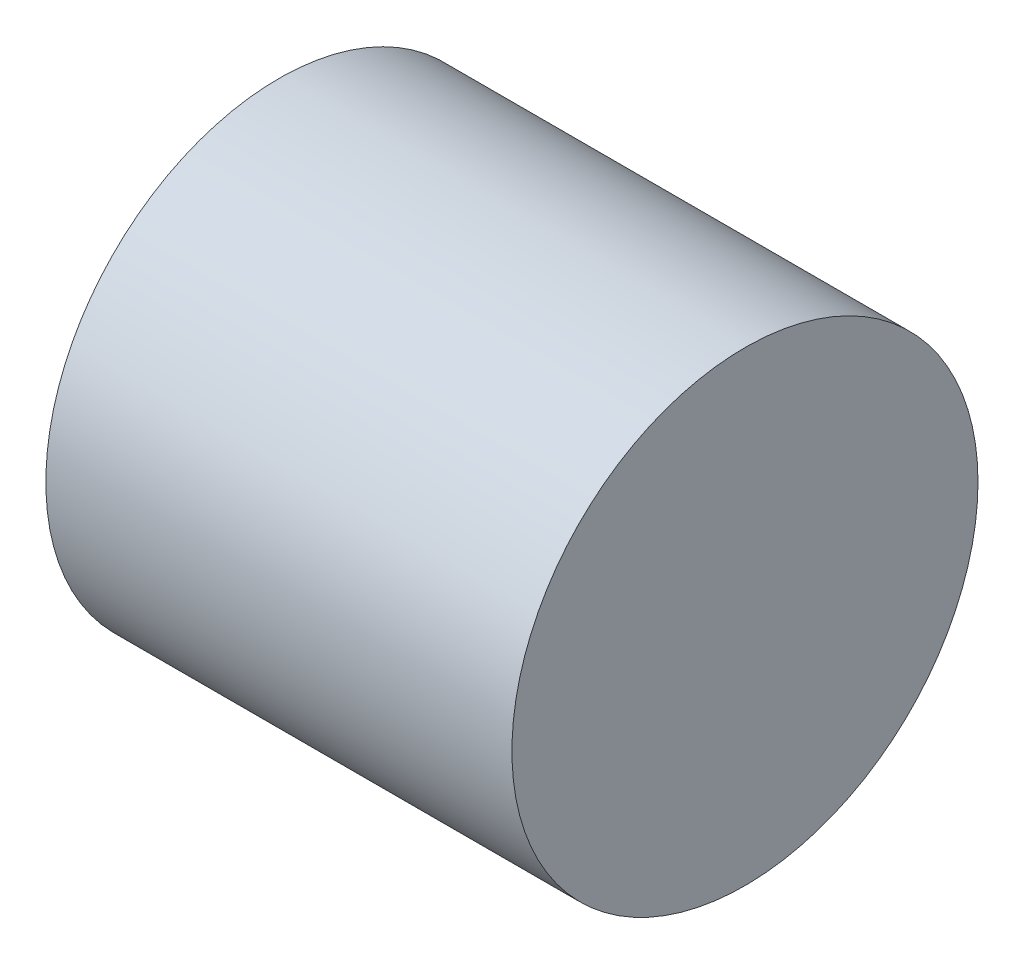
ISO-10303-21;
HEADER;
FILE_DESCRIPTION(('STEP AP214'),'2;1');
FILE_NAME('part.step','',(''),(''),'','','');
FILE_SCHEMA(('AUTOMOTIVE_DESIGN { 1 0 10303 214 1 1 1 1 }'));
ENDSEC;
DATA;
#1=APPLICATION_CONTEXT('core data for automotive mechanical design processes');
#2=APPLICATION_PROTOCOL_DEFINITION('international standard','automotive_design',2000,#1);
#3=PRODUCT_CONTEXT('',#1,'mechanical');
#4=PRODUCT('Part','Part','',(#3));
#5=PRODUCT_RELATED_PRODUCT_CATEGORY('part','',(#4));
#6=PRODUCT_DEFINITION_FORMATION('','',#4);
#7=PRODUCT_DEFINITION_CONTEXT('part definition',#1,'design');
#8=PRODUCT_DEFINITION('design','',#6,#7);
#9=PRODUCT_DEFINITION_SHAPE('','',#8);
#10=(LENGTH_UNIT() NAMED_UNIT(*) SI_UNIT(.MILLI.,.METRE.));
#11=(NAMED_UNIT(*) PLANE_ANGLE_UNIT() SI_UNIT($,.RADIAN.));
#12=(NAMED_UNIT(*) SI_UNIT($,.STERADIAN.) SOLID_ANGLE_UNIT());
#13=UNCERTAINTY_MEASURE_WITH_UNIT(LENGTH_MEASURE(1.E-05),#10,'distance_accuracy_value','');
#14=(GEOMETRIC_REPRESENTATION_CONTEXT(3) GLOBAL_UNCERTAINTY_ASSIGNED_CONTEXT((#13)) GLOBAL_UNIT_ASSIGNED_CONTEXT((#10,
#11,#12)) REPRESENTATION_CONTEXT('',''));
#15=CARTESIAN_POINT('',(0.,0.,0.));
#16=DIRECTION('',(0.,0.,1.));
#17=DIRECTION('',(1.,0.,0.));
#18=AXIS2_PLACEMENT_3D('',#15,#16,#17);
#19=CARTESIAN_POINT('',(150.,0.,0.));
#20=DIRECTION('',(-1.,0.,0.));
#21=DIRECTION('',(0.,0.,1.));
#22=AXIS2_PLACEMENT_3D('',#19,#20,#21);
#23=CYLINDRICAL_SURFACE('',#22,75.);
#24=CARTESIAN_POINT('',(150.,0.,0.));
#25=DIRECTION('',(1.,0.,0.));
#26=DIRECTION('',(0.,0.,-1.));
#27=AXIS2_PLACEMENT_3D('',#24,#25,#26);
#28=CIRCLE('',#27,75.);
#29=CARTESIAN_POINT('',(150.,0.,-75.));
#30=VERTEX_POINT('',#29);
#31=EDGE_CURVE('E10',#30,#30,#28,.T.);
#32=ORIENTED_EDGE('',*,*,#31,.F.);
#33=EDGE_LOOP('',(#32));
#34=FACE_BOUND('',#33,.T.);
#35=CARTESIAN_POINT('',(0.,0.,0.));
#36=DIRECTION('',(1.,0.,0.));
#37=DIRECTION('',(0.,0.,-1.));
#38=AXIS2_PLACEMENT_3D('',#35,#36,#37);
#39=CIRCLE('',#38,75.);
#40=CARTESIAN_POINT('',(0.,0.,-75.));
#41=VERTEX_POINT('',#40);
#42=EDGE_CURVE('E34',#41,#41,#39,.T.);
#43=ORIENTED_EDGE('',*,*,#42,.T.);
#44=EDGE_LOOP('',(#43));
#45=FACE_BOUND('',#44,.T.);
#46=ADVANCED_FACE('F31',(#34,#45),#23,.T.);
#47=CARTESIAN_POINT('',(150.,0.,0.));
#48=DIRECTION('',(1.,0.,0.));
#49=DIRECTION('',(0.,0.,-1.));
#50=AXIS2_PLACEMENT_3D('',#47,#48,#49);
#51=PLANE('',#50);
#52=ORIENTED_EDGE('',*,*,#31,.T.);
#53=EDGE_LOOP('',(#52));
#54=FACE_BOUND('',#53,.T.);
#55=ADVANCED_FACE('F46',(#54),#51,.T.);
#56=CARTESIAN_POINT('',(0.,0.,0.));
#57=DIRECTION('',(1.,0.,0.));
#58=DIRECTION('',(0.,0.,-1.));
#59=AXIS2_PLACEMENT_3D('',#56,#57,#58);
#60=PLANE('',#59);
#61=ORIENTED_EDGE('',*,*,#42,.F.);
#62=EDGE_LOOP('',(#61));
#63=FACE_BOUND('',#62,.T.);
#64=ADVANCED_FACE('F44',(#63),#60,.F.);
#65=CLOSED_SHELL('',(#46,#55,#64));
#66=MANIFOLD_SOLID_BREP('B2',#65);
#67=ADVANCED_BREP_SHAPE_REPRESENTATION('',(#18,#66),#14);
#68=SHAPE_DEFINITION_REPRESENTATION(#9,#67);
ENDSEC;
END-ISO-10303-21;
